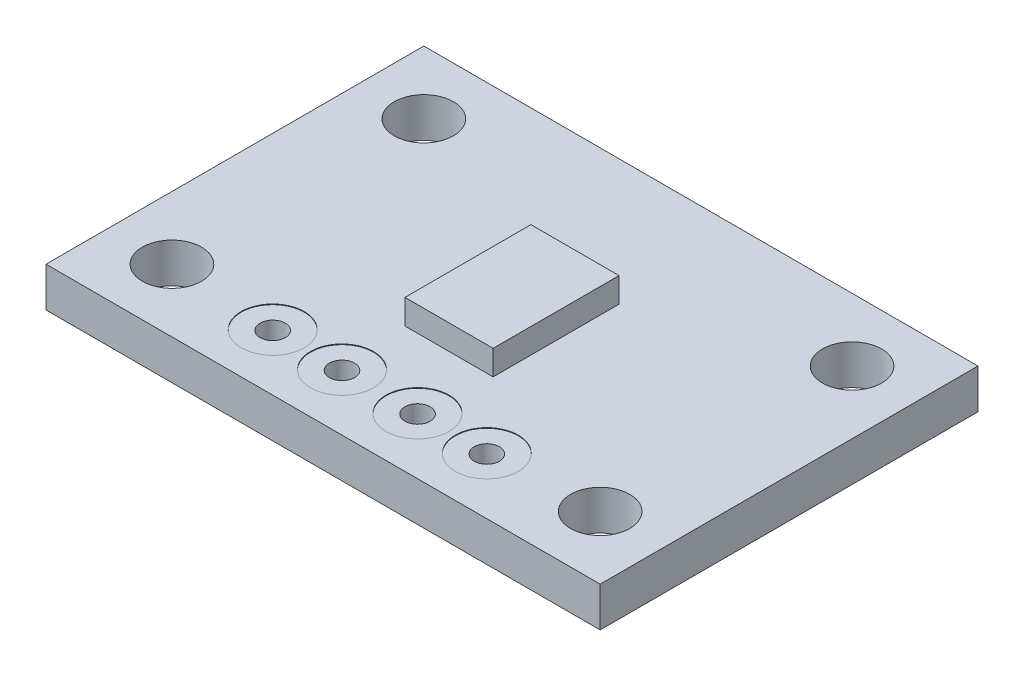
ISO-10303-21;
HEADER;
FILE_DESCRIPTION(('STEP AP214'),'2;1');
FILE_NAME('part.step','',(''),(''),'','','');
FILE_SCHEMA(('AUTOMOTIVE_DESIGN { 1 0 10303 214 1 1 1 1 }'));
ENDSEC;
DATA;
#1=APPLICATION_CONTEXT('core data for automotive mechanical design processes');
#2=APPLICATION_PROTOCOL_DEFINITION('international standard','automotive_design',2000,#1);
#3=PRODUCT_CONTEXT('',#1,'mechanical');
#4=PRODUCT('Part','Part','',(#3));
#5=PRODUCT_RELATED_PRODUCT_CATEGORY('part','',(#4));
#6=PRODUCT_DEFINITION_FORMATION('','',#4);
#7=PRODUCT_DEFINITION_CONTEXT('part definition',#1,'design');
#8=PRODUCT_DEFINITION('design','',#6,#7);
#9=PRODUCT_DEFINITION_SHAPE('','',#8);
#10=(LENGTH_UNIT() NAMED_UNIT(*) SI_UNIT(.MILLI.,.METRE.));
#11=(NAMED_UNIT(*) PLANE_ANGLE_UNIT() SI_UNIT($,.RADIAN.));
#12=(NAMED_UNIT(*) SI_UNIT($,.STERADIAN.) SOLID_ANGLE_UNIT());
#13=UNCERTAINTY_MEASURE_WITH_UNIT(LENGTH_MEASURE(1.E-05),#10,'distance_accuracy_value','');
#14=(GEOMETRIC_REPRESENTATION_CONTEXT(3) GLOBAL_UNCERTAINTY_ASSIGNED_CONTEXT((#13)) GLOBAL_UNIT_ASSIGNED_CONTEXT((#10,
#11,#12)) REPRESENTATION_CONTEXT('',''));
#15=CARTESIAN_POINT('',(0.,0.,0.));
#16=DIRECTION('',(0.,0.,1.));
#17=DIRECTION('',(1.,0.,0.));
#18=AXIS2_PLACEMENT_3D('',#15,#16,#17);
#19=CARTESIAN_POINT('',(-1.524,-0.8,5.334));
#20=DIRECTION('',(0.,1.,0.));
#21=DIRECTION('',(0.,0.,1.));
#22=AXIS2_PLACEMENT_3D('',#19,#20,#21);
#23=CYLINDRICAL_SURFACE('',#22,0.508);
#24=CARTESIAN_POINT('',(-1.524,0.7746,5.334));
#25=DIRECTION('',(0.,1.,0.));
#26=DIRECTION('',(0.,0.,1.));
#27=AXIS2_PLACEMENT_3D('',#24,#25,#26);
#28=CIRCLE('',#27,0.508);
#29=CARTESIAN_POINT('',(-1.524,0.7746,5.842));
#30=VERTEX_POINT('',#29);
#31=EDGE_CURVE('E188',#30,#30,#28,.F.);
#32=ORIENTED_EDGE('',*,*,#31,.F.);
#33=EDGE_LOOP('',(#32));
#34=FACE_BOUND('',#33,.T.);
#35=CARTESIAN_POINT('',(-1.524,-0.7746,5.334));
#36=DIRECTION('',(0.,-1.,0.));
#37=DIRECTION('',(0.,0.,-1.));
#38=AXIS2_PLACEMENT_3D('',#35,#36,#37);
#39=CIRCLE('',#38,0.508);
#40=CARTESIAN_POINT('',(-1.524,-0.7746,4.826));
#41=VERTEX_POINT('',#40);
#42=EDGE_CURVE('E40',#41,#41,#39,.F.);
#43=ORIENTED_EDGE('',*,*,#42,.F.);
#44=EDGE_LOOP('',(#43));
#45=FACE_BOUND('',#44,.T.);
#46=ADVANCED_FACE('F36',(#34,#45),#23,.F.);
#47=CARTESIAN_POINT('',(1.524,-0.8,5.334));
#48=DIRECTION('',(0.,1.,0.));
#49=DIRECTION('',(0.,0.,1.));
#50=AXIS2_PLACEMENT_3D('',#47,#48,#49);
#51=CYLINDRICAL_SURFACE('',#50,0.508);
#52=CARTESIAN_POINT('',(1.524,0.7746,5.334));
#53=DIRECTION('',(0.,1.,0.));
#54=DIRECTION('',(0.,0.,1.));
#55=AXIS2_PLACEMENT_3D('',#52,#53,#54);
#56=CIRCLE('',#55,0.508);
#57=CARTESIAN_POINT('',(1.524,0.7746,5.842));
#58=VERTEX_POINT('',#57);
#59=EDGE_CURVE('E185',#58,#58,#56,.F.);
#60=ORIENTED_EDGE('',*,*,#59,.F.);
#61=EDGE_LOOP('',(#60));
#62=FACE_BOUND('',#61,.T.);
#63=CARTESIAN_POINT('',(1.524,-0.7746,5.334));
#64=DIRECTION('',(0.,-1.,0.));
#65=DIRECTION('',(0.,0.,-1.));
#66=AXIS2_PLACEMENT_3D('',#63,#64,#65);
#67=CIRCLE('',#66,0.508);
#68=CARTESIAN_POINT('',(1.524,-0.7746,4.826));
#69=VERTEX_POINT('',#68);
#70=EDGE_CURVE('E197',#69,#69,#67,.F.);
#71=ORIENTED_EDGE('',*,*,#70,.F.);
#72=EDGE_LOOP('',(#71));
#73=FACE_BOUND('',#72,.T.);
#74=ADVANCED_FACE('F249',(#62,#73),#51,.F.);
#75=CARTESIAN_POINT('',(4.318,-0.8,5.334));
#76=DIRECTION('',(0.,1.,0.));
#77=DIRECTION('',(0.,0.,1.));
#78=AXIS2_PLACEMENT_3D('',#75,#76,#77);
#79=CYLINDRICAL_SURFACE('',#78,0.508);
#80=CARTESIAN_POINT('',(4.318,0.7746,5.334));
#81=DIRECTION('',(0.,1.,0.));
#82=DIRECTION('',(0.,0.,1.));
#83=AXIS2_PLACEMENT_3D('',#80,#81,#82);
#84=CIRCLE('',#83,0.508);
#85=CARTESIAN_POINT('',(4.318,0.7746,5.842));
#86=VERTEX_POINT('',#85);
#87=EDGE_CURVE('E181',#86,#86,#84,.F.);
#88=ORIENTED_EDGE('',*,*,#87,.F.);
#89=EDGE_LOOP('',(#88));
#90=FACE_BOUND('',#89,.T.);
#91=CARTESIAN_POINT('',(4.318,-0.7746,5.334));
#92=DIRECTION('',(0.,-1.,0.));
#93=DIRECTION('',(0.,0.,-1.));
#94=AXIS2_PLACEMENT_3D('',#91,#92,#93);
#95=CIRCLE('',#94,0.508);
#96=CARTESIAN_POINT('',(4.318,-0.7746,4.826));
#97=VERTEX_POINT('',#96);
#98=EDGE_CURVE('E194',#97,#97,#95,.F.);
#99=ORIENTED_EDGE('',*,*,#98,.F.);
#100=EDGE_LOOP('',(#99));
#101=FACE_BOUND('',#100,.T.);
#102=ADVANCED_FACE('F242',(#90,#101),#79,.F.);
#103=CARTESIAN_POINT('',(-4.318,-0.8,5.334));
#104=DIRECTION('',(0.,1.,0.));
#105=DIRECTION('',(0.,0.,1.));
#106=AXIS2_PLACEMENT_3D('',#103,#104,#105);
#107=CYLINDRICAL_SURFACE('',#106,0.508);
#108=CARTESIAN_POINT('',(-4.318,0.7746,5.334));
#109=DIRECTION('',(0.,1.,0.));
#110=DIRECTION('',(0.,0.,1.));
#111=AXIS2_PLACEMENT_3D('',#108,#109,#110);
#112=CIRCLE('',#111,0.508);
#113=CARTESIAN_POINT('',(-4.318,0.7746,5.842));
#114=VERTEX_POINT('',#113);
#115=EDGE_CURVE('E178',#114,#114,#112,.F.);
#116=ORIENTED_EDGE('',*,*,#115,.F.);
#117=EDGE_LOOP('',(#116));
#118=FACE_BOUND('',#117,.T.);
#119=CARTESIAN_POINT('',(-4.318,-0.7746,5.334));
#120=DIRECTION('',(0.,-1.,0.));
#121=DIRECTION('',(0.,0.,-1.));
#122=AXIS2_PLACEMENT_3D('',#119,#120,#121);
#123=CIRCLE('',#122,0.508);
#124=CARTESIAN_POINT('',(-4.318,-0.7746,4.826));
#125=VERTEX_POINT('',#124);
#126=EDGE_CURVE('E191',#125,#125,#123,.F.);
#127=ORIENTED_EDGE('',*,*,#126,.F.);
#128=EDGE_LOOP('',(#127));
#129=FACE_BOUND('',#128,.T.);
#130=ADVANCED_FACE('F233',(#118,#129),#107,.F.);
#131=CARTESIAN_POINT('',(0.,0.8,0.));
#132=DIRECTION('',(0.,-1.,0.));
#133=DIRECTION('',(0.,0.,-1.));
#134=AXIS2_PLACEMENT_3D('',#131,#132,#133);
#135=PLANE('',#134);
#136=CARTESIAN_POINT('',(-4.318,0.8,5.334));
#137=DIRECTION('',(0.,1.,0.));
#138=DIRECTION('',(0.,0.,1.));
#139=AXIS2_PLACEMENT_3D('',#136,#137,#138);
#140=CIRCLE('',#139,1.27);
#141=CARTESIAN_POINT('',(-4.318,0.8,6.604));
#142=VERTEX_POINT('',#141);
#143=EDGE_CURVE('E615',#142,#142,#140,.T.);
#144=ORIENTED_EDGE('',*,*,#143,.F.);
#145=EDGE_LOOP('',(#144));
#146=FACE_BOUND('',#145,.T.);
#147=CARTESIAN_POINT('',(-1.524,0.8,5.334));
#148=DIRECTION('',(0.,1.,0.));
#149=DIRECTION('',(0.,0.,1.));
#150=AXIS2_PLACEMENT_3D('',#147,#148,#149);
#151=CIRCLE('',#150,1.27);
#152=CARTESIAN_POINT('',(-1.524,0.8,6.604));
#153=VERTEX_POINT('',#152);
#154=EDGE_CURVE('E607',#153,#153,#151,.T.);
#155=ORIENTED_EDGE('',*,*,#154,.F.);
#156=EDGE_LOOP('',(#155));
#157=FACE_BOUND('',#156,.T.);
#158=CARTESIAN_POINT('',(1.524,0.8,5.334));
#159=DIRECTION('',(0.,1.,0.));
#160=DIRECTION('',(0.,0.,1.));
#161=AXIS2_PLACEMENT_3D('',#158,#159,#160);
#162=CIRCLE('',#161,1.27);
#163=CARTESIAN_POINT('',(1.524,0.8,6.604));
#164=VERTEX_POINT('',#163);
#165=EDGE_CURVE('E211',#164,#164,#162,.T.);
#166=ORIENTED_EDGE('',*,*,#165,.F.);
#167=EDGE_LOOP('',(#166));
#168=FACE_BOUND('',#167,.T.);
#169=CARTESIAN_POINT('',(4.318,0.8,5.334));
#170=DIRECTION('',(0.,1.,0.));
#171=DIRECTION('',(0.,0.,1.));
#172=AXIS2_PLACEMENT_3D('',#169,#170,#171);
#173=CIRCLE('',#172,1.27);
#174=CARTESIAN_POINT('',(4.318,0.8,6.604));
#175=VERTEX_POINT('',#174);
#176=EDGE_CURVE('E202',#175,#175,#173,.T.);
#177=ORIENTED_EDGE('',*,*,#176,.F.);
#178=EDGE_LOOP('',(#177));
#179=FACE_BOUND('',#178,.T.);
#180=CARTESIAN_POINT('',(-8.63599999999999,0.8,-5.08));
#181=DIRECTION('',(0.,1.,0.));
#182=DIRECTION('',(0.,0.,-1.));
#183=AXIS2_PLACEMENT_3D('',#180,#181,#182);
#184=CIRCLE('',#183,1.1938);
#185=CARTESIAN_POINT('',(-8.63599999999999,0.8,-6.2738));
#186=VERTEX_POINT('',#185);
#187=EDGE_CURVE('E126',#186,#186,#184,.T.);
#188=ORIENTED_EDGE('',*,*,#187,.F.);
#189=EDGE_LOOP('',(#188));
#190=FACE_BOUND('',#189,.T.);
#191=CARTESIAN_POINT('',(-8.63599999999999,0.8,5.07999999999999));
#192=DIRECTION('',(0.,1.,0.));
#193=DIRECTION('',(0.,0.,1.));
#194=AXIS2_PLACEMENT_3D('',#191,#192,#193);
#195=CIRCLE('',#194,1.1938);
#196=CARTESIAN_POINT('',(-8.63599999999999,0.8,6.27379999999999));
#197=VERTEX_POINT('',#196);
#198=EDGE_CURVE('E135',#197,#197,#195,.T.);
#199=ORIENTED_EDGE('',*,*,#198,.F.);
#200=EDGE_LOOP('',(#199));
#201=FACE_BOUND('',#200,.T.);
#202=CARTESIAN_POINT('',(8.636,0.8,5.07999999999999));
#203=DIRECTION('',(0.,1.,0.));
#204=DIRECTION('',(0.,0.,-1.));
#205=AXIS2_PLACEMENT_3D('',#202,#203,#204);
#206=CIRCLE('',#205,1.1938);
#207=CARTESIAN_POINT('',(8.636,0.8,3.8862));
#208=VERTEX_POINT('',#207);
#209=EDGE_CURVE('E141',#208,#208,#206,.T.);
#210=ORIENTED_EDGE('',*,*,#209,.F.);
#211=EDGE_LOOP('',(#210));
#212=FACE_BOUND('',#211,.T.);
#213=CARTESIAN_POINT('',(8.636,0.8,-5.08));
#214=DIRECTION('',(0.,1.,0.));
#215=DIRECTION('',(0.,0.,1.));
#216=AXIS2_PLACEMENT_3D('',#213,#214,#215);
#217=CIRCLE('',#216,1.1938);
#218=CARTESIAN_POINT('',(8.636,0.8,-3.8862));
#219=VERTEX_POINT('',#218);
#220=EDGE_CURVE('E147',#219,#219,#217,.T.);
#221=ORIENTED_EDGE('',*,*,#220,.F.);
#222=EDGE_LOOP('',(#221));
#223=FACE_BOUND('',#222,.T.);
#224=DIRECTION('',(0.,0.,-1.));
#225=VECTOR('',#224,1.);
#226=CARTESIAN_POINT('',(11.176,0.8,7.62));
#227=LINE('',#226,#225);
#228=CARTESIAN_POINT('',(11.176,0.8,7.62));
#229=VERTEX_POINT('',#228);
#230=CARTESIAN_POINT('',(11.176,0.8,-7.62));
#231=VERTEX_POINT('',#230);
#232=EDGE_CURVE('E153',#229,#231,#227,.T.);
#233=ORIENTED_EDGE('',*,*,#232,.T.);
#234=DIRECTION('',(-1.,0.,0.));
#235=VECTOR('',#234,1.);
#236=CARTESIAN_POINT('',(-11.176,0.8,-7.62));
#237=LINE('',#236,#235);
#238=CARTESIAN_POINT('',(-11.176,0.8,-7.62));
#239=VERTEX_POINT('',#238);
#240=EDGE_CURVE('E156',#231,#239,#237,.T.);
#241=ORIENTED_EDGE('',*,*,#240,.T.);
#242=DIRECTION('',(0.,0.,1.));
#243=VECTOR('',#242,1.);
#244=CARTESIAN_POINT('',(-11.176,0.8,7.62));
#245=LINE('',#244,#243);
#246=CARTESIAN_POINT('',(-11.176,0.8,7.62));
#247=VERTEX_POINT('',#246);
#248=EDGE_CURVE('E159',#239,#247,#245,.T.);
#249=ORIENTED_EDGE('',*,*,#248,.T.);
#250=DIRECTION('',(1.,0.,0.));
#251=VECTOR('',#250,1.);
#252=CARTESIAN_POINT('',(-11.176,0.8,7.62));
#253=LINE('',#252,#251);
#254=EDGE_CURVE('E161',#247,#229,#253,.T.);
#255=ORIENTED_EDGE('',*,*,#254,.T.);
#256=EDGE_LOOP('',(#233,#241,#249,#255));
#257=FACE_BOUND('',#256,.T.);
#258=DIRECTION('',(0.,0.,-1.));
#259=VECTOR('',#258,1.);
#260=CARTESIAN_POINT('',(1.778,0.8,2.54));
#261=LINE('',#260,#259);
#262=CARTESIAN_POINT('',(1.778,0.8,2.54));
#263=VERTEX_POINT('',#262);
#264=CARTESIAN_POINT('',(1.778,0.8,-2.54));
#265=VERTEX_POINT('',#264);
#266=EDGE_CURVE('E53',#263,#265,#261,.T.);
#267=ORIENTED_EDGE('',*,*,#266,.F.);
#268=DIRECTION('',(1.,0.,0.));
#269=VECTOR('',#268,1.);
#270=CARTESIAN_POINT('',(-1.778,0.8,2.54));
#271=LINE('',#270,#269);
#272=CARTESIAN_POINT('',(-1.778,0.8,2.54));
#273=VERTEX_POINT('',#272);
#274=EDGE_CURVE('E57',#273,#263,#271,.T.);
#275=ORIENTED_EDGE('',*,*,#274,.F.);
#276=DIRECTION('',(0.,0.,1.));
#277=VECTOR('',#276,1.);
#278=CARTESIAN_POINT('',(-1.778,0.8,2.54));
#279=LINE('',#278,#277);
#280=CARTESIAN_POINT('',(-1.778,0.8,-2.54));
#281=VERTEX_POINT('',#280);
#282=EDGE_CURVE('E221',#281,#273,#279,.T.);
#283=ORIENTED_EDGE('',*,*,#282,.F.);
#284=DIRECTION('',(-1.,0.,0.));
#285=VECTOR('',#284,1.);
#286=CARTESIAN_POINT('',(-1.778,0.8,-2.54));
#287=LINE('',#286,#285);
#288=EDGE_CURVE('E219',#265,#281,#287,.T.);
#289=ORIENTED_EDGE('',*,*,#288,.F.);
#290=EDGE_LOOP('',(#267,#275,#283,#289));
#291=FACE_BOUND('',#290,.T.);
#292=ADVANCED_FACE('F230',(#146,#157,#168,#179,#190,#201,#212,#223,#257,#291),#135,.F.);
#293=CARTESIAN_POINT('',(0.,-0.8,0.));
#294=DIRECTION('',(0.,-1.,0.));
#295=DIRECTION('',(0.,0.,-1.));
#296=AXIS2_PLACEMENT_3D('',#293,#294,#295);
#297=PLANE('',#296);
#298=CARTESIAN_POINT('',(-4.318,-0.8,5.334));
#299=DIRECTION('',(0.,1.,0.));
#300=DIRECTION('',(0.,0.,1.));
#301=AXIS2_PLACEMENT_3D('',#298,#299,#300);
#302=CIRCLE('',#301,1.27);
#303=CARTESIAN_POINT('',(-4.318,-0.8,6.604));
#304=VERTEX_POINT('',#303);
#305=EDGE_CURVE('E638',#304,#304,#302,.T.);
#306=ORIENTED_EDGE('',*,*,#305,.T.);
#307=EDGE_LOOP('',(#306));
#308=FACE_BOUND('',#307,.T.);
#309=CARTESIAN_POINT('',(-1.524,-0.8,5.334));
#310=DIRECTION('',(0.,1.,0.));
#311=DIRECTION('',(0.,0.,1.));
#312=AXIS2_PLACEMENT_3D('',#309,#310,#311);
#313=CIRCLE('',#312,1.27);
#314=CARTESIAN_POINT('',(-1.524,-0.8,6.604));
#315=VERTEX_POINT('',#314);
#316=EDGE_CURVE('E632',#315,#315,#313,.T.);
#317=ORIENTED_EDGE('',*,*,#316,.T.);
#318=EDGE_LOOP('',(#317));
#319=FACE_BOUND('',#318,.T.);
#320=CARTESIAN_POINT('',(1.524,-0.8,5.334));
#321=DIRECTION('',(0.,1.,0.));
#322=DIRECTION('',(0.,0.,1.));
#323=AXIS2_PLACEMENT_3D('',#320,#321,#322);
#324=CIRCLE('',#323,1.27);
#325=CARTESIAN_POINT('',(1.524,-0.8,6.604));
#326=VERTEX_POINT('',#325);
#327=EDGE_CURVE('E626',#326,#326,#324,.T.);
#328=ORIENTED_EDGE('',*,*,#327,.T.);
#329=EDGE_LOOP('',(#328));
#330=FACE_BOUND('',#329,.T.);
#331=CARTESIAN_POINT('',(4.318,-0.8,5.334));
#332=DIRECTION('',(0.,1.,0.));
#333=DIRECTION('',(0.,0.,1.));
#334=AXIS2_PLACEMENT_3D('',#331,#332,#333);
#335=CIRCLE('',#334,1.27);
#336=CARTESIAN_POINT('',(4.318,-0.8,6.604));
#337=VERTEX_POINT('',#336);
#338=EDGE_CURVE('E620',#337,#337,#335,.T.);
#339=ORIENTED_EDGE('',*,*,#338,.T.);
#340=EDGE_LOOP('',(#339));
#341=FACE_BOUND('',#340,.T.);
#342=CARTESIAN_POINT('',(-8.63599999999999,-0.8,5.07999999999999));
#343=DIRECTION('',(0.,1.,0.));
#344=DIRECTION('',(0.,0.,1.));
#345=AXIS2_PLACEMENT_3D('',#342,#343,#344);
#346=CIRCLE('',#345,1.1938);
#347=CARTESIAN_POINT('',(-8.63599999999999,-0.8,6.27379999999999));
#348=VERTEX_POINT('',#347);
#349=EDGE_CURVE('E133',#348,#348,#346,.T.);
#350=ORIENTED_EDGE('',*,*,#349,.T.);
#351=EDGE_LOOP('',(#350));
#352=FACE_BOUND('',#351,.T.);
#353=CARTESIAN_POINT('',(8.636,-0.8,-5.08));
#354=DIRECTION('',(0.,1.,0.));
#355=DIRECTION('',(0.,0.,1.));
#356=AXIS2_PLACEMENT_3D('',#353,#354,#355);
#357=CIRCLE('',#356,1.1938);
#358=CARTESIAN_POINT('',(8.636,-0.8,-3.8862));
#359=VERTEX_POINT('',#358);
#360=EDGE_CURVE('E144',#359,#359,#357,.T.);
#361=ORIENTED_EDGE('',*,*,#360,.T.);
#362=EDGE_LOOP('',(#361));
#363=FACE_BOUND('',#362,.T.);
#364=DIRECTION('',(0.,0.,-1.));
#365=VECTOR('',#364,1.);
#366=CARTESIAN_POINT('',(11.176,-0.8,7.62));
#367=LINE('',#366,#365);
#368=CARTESIAN_POINT('',(11.176,-0.8,7.62));
#369=VERTEX_POINT('',#368);
#370=CARTESIAN_POINT('',(11.176,-0.8,-7.62));
#371=VERTEX_POINT('',#370);
#372=EDGE_CURVE('E150',#369,#371,#367,.T.);
#373=ORIENTED_EDGE('',*,*,#372,.F.);
#374=DIRECTION('',(1.,0.,0.));
#375=VECTOR('',#374,1.);
#376=CARTESIAN_POINT('',(-11.176,-0.8,7.62));
#377=LINE('',#376,#375);
#378=CARTESIAN_POINT('',(-11.176,-0.8,7.62));
#379=VERTEX_POINT('',#378);
#380=EDGE_CURVE('E157',#379,#369,#377,.T.);
#381=ORIENTED_EDGE('',*,*,#380,.F.);
#382=DIRECTION('',(0.,0.,1.));
#383=VECTOR('',#382,1.);
#384=CARTESIAN_POINT('',(-11.176,-0.8,7.62));
#385=LINE('',#384,#383);
#386=CARTESIAN_POINT('',(-11.176,-0.8,-7.62));
#387=VERTEX_POINT('',#386);
#388=EDGE_CURVE('E168',#387,#379,#385,.T.);
#389=ORIENTED_EDGE('',*,*,#388,.F.);
#390=DIRECTION('',(-1.,0.,0.));
#391=VECTOR('',#390,1.);
#392=CARTESIAN_POINT('',(-11.176,-0.8,-7.62));
#393=LINE('',#392,#391);
#394=EDGE_CURVE('E166',#371,#387,#393,.T.);
#395=ORIENTED_EDGE('',*,*,#394,.F.);
#396=EDGE_LOOP('',(#373,#381,#389,#395));
#397=FACE_BOUND('',#396,.T.);
#398=CARTESIAN_POINT('',(8.636,-0.8,5.07999999999999));
#399=DIRECTION('',(0.,1.,0.));
#400=DIRECTION('',(0.,0.,-1.));
#401=AXIS2_PLACEMENT_3D('',#398,#399,#400);
#402=CIRCLE('',#401,1.1938);
#403=CARTESIAN_POINT('',(8.636,-0.8,3.8862));
#404=VERTEX_POINT('',#403);
#405=EDGE_CURVE('E138',#404,#404,#402,.T.);
#406=ORIENTED_EDGE('',*,*,#405,.T.);
#407=EDGE_LOOP('',(#406));
#408=FACE_BOUND('',#407,.T.);
#409=CARTESIAN_POINT('',(-8.63599999999999,-0.8,-5.08));
#410=DIRECTION('',(0.,1.,0.));
#411=DIRECTION('',(0.,0.,-1.));
#412=AXIS2_PLACEMENT_3D('',#409,#410,#411);
#413=CIRCLE('',#412,1.1938);
#414=CARTESIAN_POINT('',(-8.63599999999999,-0.8,-6.2738));
#415=VERTEX_POINT('',#414);
#416=EDGE_CURVE('E123',#415,#415,#413,.T.);
#417=ORIENTED_EDGE('',*,*,#416,.T.);
#418=EDGE_LOOP('',(#417));
#419=FACE_BOUND('',#418,.T.);
#420=ADVANCED_FACE('F232',(#308,#319,#330,#341,#352,#363,#397,#408,#419),#297,.T.);
#421=CARTESIAN_POINT('',(11.176,0.8,7.62));
#422=DIRECTION('',(-1.,0.,0.));
#423=DIRECTION('',(0.,0.,1.));
#424=AXIS2_PLACEMENT_3D('',#421,#422,#423);
#425=PLANE('',#424);
#426=ORIENTED_EDGE('',*,*,#372,.T.);
#427=DIRECTION('',(0.,-1.,0.));
#428=VECTOR('',#427,1.);
#429=CARTESIAN_POINT('',(11.176,0.8,-7.62));
#430=LINE('',#429,#428);
#431=EDGE_CURVE('E11',#231,#371,#430,.T.);
#432=ORIENTED_EDGE('',*,*,#431,.F.);
#433=ORIENTED_EDGE('',*,*,#232,.F.);
#434=DIRECTION('',(0.,-1.,0.));
#435=VECTOR('',#434,1.);
#436=CARTESIAN_POINT('',(11.176,0.8,7.62));
#437=LINE('',#436,#435);
#438=EDGE_CURVE('E163',#229,#369,#437,.T.);
#439=ORIENTED_EDGE('',*,*,#438,.T.);
#440=EDGE_LOOP('',(#426,#432,#433,#439));
#441=FACE_BOUND('',#440,.T.);
#442=ADVANCED_FACE('F38',(#441),#425,.F.);
#443=CARTESIAN_POINT('',(-11.176,0.8,-7.62));
#444=DIRECTION('',(0.,0.,1.));
#445=DIRECTION('',(1.,0.,0.));
#446=AXIS2_PLACEMENT_3D('',#443,#444,#445);
#447=PLANE('',#446);
#448=ORIENTED_EDGE('',*,*,#394,.T.);
#449=DIRECTION('',(0.,-1.,0.));
#450=VECTOR('',#449,1.);
#451=CARTESIAN_POINT('',(-11.176,0.8,-7.62));
#452=LINE('',#451,#450);
#453=EDGE_CURVE('E45',#239,#387,#452,.T.);
#454=ORIENTED_EDGE('',*,*,#453,.F.);
#455=ORIENTED_EDGE('',*,*,#240,.F.);
#456=ORIENTED_EDGE('',*,*,#431,.T.);
#457=EDGE_LOOP('',(#448,#454,#455,#456));
#458=FACE_BOUND('',#457,.T.);
#459=ADVANCED_FACE('F317',(#458),#447,.F.);
#460=CARTESIAN_POINT('',(-11.176,0.8,7.62));
#461=DIRECTION('',(1.,0.,0.));
#462=DIRECTION('',(0.,0.,-1.));
#463=AXIS2_PLACEMENT_3D('',#460,#461,#462);
#464=PLANE('',#463);
#465=ORIENTED_EDGE('',*,*,#388,.T.);
#466=DIRECTION('',(0.,-1.,0.));
#467=VECTOR('',#466,1.);
#468=CARTESIAN_POINT('',(-11.176,0.8,7.62));
#469=LINE('',#468,#467);
#470=EDGE_CURVE('E173',#247,#379,#469,.T.);
#471=ORIENTED_EDGE('',*,*,#470,.F.);
#472=ORIENTED_EDGE('',*,*,#248,.F.);
#473=ORIENTED_EDGE('',*,*,#453,.T.);
#474=EDGE_LOOP('',(#465,#471,#472,#473));
#475=FACE_BOUND('',#474,.T.);
#476=ADVANCED_FACE('F290',(#475),#464,.F.);
#477=CARTESIAN_POINT('',(-11.176,0.8,7.62));
#478=DIRECTION('',(0.,0.,-1.));
#479=DIRECTION('',(-1.,0.,0.));
#480=AXIS2_PLACEMENT_3D('',#477,#478,#479);
#481=PLANE('',#480);
#482=ORIENTED_EDGE('',*,*,#380,.T.);
#483=ORIENTED_EDGE('',*,*,#438,.F.);
#484=ORIENTED_EDGE('',*,*,#254,.F.);
#485=ORIENTED_EDGE('',*,*,#470,.T.);
#486=EDGE_LOOP('',(#482,#483,#484,#485));
#487=FACE_BOUND('',#486,.T.);
#488=ADVANCED_FACE('F285',(#487),#481,.F.);
#489=CARTESIAN_POINT('',(8.636,0.8,-5.08));
#490=DIRECTION('',(0.,-1.,0.));
#491=DIRECTION('',(0.,0.,-1.));
#492=AXIS2_PLACEMENT_3D('',#489,#490,#491);
#493=CYLINDRICAL_SURFACE('',#492,1.1938);
#494=ORIENTED_EDGE('',*,*,#220,.T.);
#495=EDGE_LOOP('',(#494));
#496=FACE_BOUND('',#495,.T.);
#497=ORIENTED_EDGE('',*,*,#360,.F.);
#498=EDGE_LOOP('',(#497));
#499=FACE_BOUND('',#498,.T.);
#500=ADVANCED_FACE('F282',(#496,#499),#493,.F.);
#501=CARTESIAN_POINT('',(8.636,0.8,5.07999999999999));
#502=DIRECTION('',(0.,-1.,0.));
#503=DIRECTION('',(0.,0.,-1.));
#504=AXIS2_PLACEMENT_3D('',#501,#502,#503);
#505=CYLINDRICAL_SURFACE('',#504,1.1938);
#506=ORIENTED_EDGE('',*,*,#209,.T.);
#507=EDGE_LOOP('',(#506));
#508=FACE_BOUND('',#507,.T.);
#509=ORIENTED_EDGE('',*,*,#405,.F.);
#510=EDGE_LOOP('',(#509));
#511=FACE_BOUND('',#510,.T.);
#512=ADVANCED_FACE('F279',(#508,#511),#505,.F.);
#513=CARTESIAN_POINT('',(-8.63599999999999,0.8,5.07999999999999));
#514=DIRECTION('',(0.,-1.,0.));
#515=DIRECTION('',(0.,0.,-1.));
#516=AXIS2_PLACEMENT_3D('',#513,#514,#515);
#517=CYLINDRICAL_SURFACE('',#516,1.1938);
#518=ORIENTED_EDGE('',*,*,#198,.T.);
#519=EDGE_LOOP('',(#518));
#520=FACE_BOUND('',#519,.T.);
#521=ORIENTED_EDGE('',*,*,#349,.F.);
#522=EDGE_LOOP('',(#521));
#523=FACE_BOUND('',#522,.T.);
#524=ADVANCED_FACE('F275',(#520,#523),#517,.F.);
#525=CARTESIAN_POINT('',(-8.63599999999999,0.8,-5.08));
#526=DIRECTION('',(0.,-1.,0.));
#527=DIRECTION('',(0.,0.,-1.));
#528=AXIS2_PLACEMENT_3D('',#525,#526,#527);
#529=CYLINDRICAL_SURFACE('',#528,1.1938);
#530=ORIENTED_EDGE('',*,*,#187,.T.);
#531=EDGE_LOOP('',(#530));
#532=FACE_BOUND('',#531,.T.);
#533=ORIENTED_EDGE('',*,*,#416,.F.);
#534=EDGE_LOOP('',(#533));
#535=FACE_BOUND('',#534,.T.);
#536=ADVANCED_FACE('F272',(#532,#535),#529,.F.);
#537=CARTESIAN_POINT('',(1.778,1.8,2.54));
#538=DIRECTION('',(-1.,0.,0.));
#539=DIRECTION('',(0.,0.,1.));
#540=AXIS2_PLACEMENT_3D('',#537,#538,#539);
#541=PLANE('',#540);
#542=ORIENTED_EDGE('',*,*,#266,.T.);
#543=DIRECTION('',(0.,-1.,0.));
#544=VECTOR('',#543,1.);
#545=CARTESIAN_POINT('',(1.778,1.8,-2.54));
#546=LINE('',#545,#544);
#547=CARTESIAN_POINT('',(1.778,1.8,-2.54));
#548=VERTEX_POINT('',#547);
#549=EDGE_CURVE('E106',#548,#265,#546,.T.);
#550=ORIENTED_EDGE('',*,*,#549,.F.);
#551=DIRECTION('',(0.,0.,-1.));
#552=VECTOR('',#551,1.);
#553=CARTESIAN_POINT('',(1.778,1.8,2.54));
#554=LINE('',#553,#552);
#555=CARTESIAN_POINT('',(1.778,1.8,2.54));
#556=VERTEX_POINT('',#555);
#557=EDGE_CURVE('E112',#556,#548,#554,.T.);
#558=ORIENTED_EDGE('',*,*,#557,.F.);
#559=DIRECTION('',(0.,-1.,0.));
#560=VECTOR('',#559,1.);
#561=CARTESIAN_POINT('',(1.778,1.8,2.54));
#562=LINE('',#561,#560);
#563=EDGE_CURVE('E217',#556,#263,#562,.T.);
#564=ORIENTED_EDGE('',*,*,#563,.T.);
#565=EDGE_LOOP('',(#542,#550,#558,#564));
#566=FACE_BOUND('',#565,.T.);
#567=ADVANCED_FACE('F122',(#566),#541,.F.);
#568=CARTESIAN_POINT('',(-1.778,1.8,-2.54));
#569=DIRECTION('',(0.,0.,1.));
#570=DIRECTION('',(1.,0.,0.));
#571=AXIS2_PLACEMENT_3D('',#568,#569,#570);
#572=PLANE('',#571);
#573=ORIENTED_EDGE('',*,*,#288,.T.);
#574=DIRECTION('',(0.,-1.,0.));
#575=VECTOR('',#574,1.);
#576=CARTESIAN_POINT('',(-1.778,1.8,-2.54));
#577=LINE('',#576,#575);
#578=CARTESIAN_POINT('',(-1.778,1.8,-2.54));
#579=VERTEX_POINT('',#578);
#580=EDGE_CURVE('E108',#579,#281,#577,.T.);
#581=ORIENTED_EDGE('',*,*,#580,.F.);
#582=DIRECTION('',(-1.,0.,0.));
#583=VECTOR('',#582,1.);
#584=CARTESIAN_POINT('',(-1.778,1.8,-2.54));
#585=LINE('',#584,#583);
#586=EDGE_CURVE('E101',#548,#579,#585,.T.);
#587=ORIENTED_EDGE('',*,*,#586,.F.);
#588=ORIENTED_EDGE('',*,*,#549,.T.);
#589=EDGE_LOOP('',(#573,#581,#587,#588));
#590=FACE_BOUND('',#589,.T.);
#591=ADVANCED_FACE('F104',(#590),#572,.F.);
#592=CARTESIAN_POINT('',(-1.778,1.8,2.54));
#593=DIRECTION('',(1.,0.,0.));
#594=DIRECTION('',(0.,0.,-1.));
#595=AXIS2_PLACEMENT_3D('',#592,#593,#594);
#596=PLANE('',#595);
#597=ORIENTED_EDGE('',*,*,#282,.T.);
#598=DIRECTION('',(0.,-1.,0.));
#599=VECTOR('',#598,1.);
#600=CARTESIAN_POINT('',(-1.778,1.8,2.54));
#601=LINE('',#600,#599);
#602=CARTESIAN_POINT('',(-1.778,1.8,2.54));
#603=VERTEX_POINT('',#602);
#604=EDGE_CURVE('E128',#603,#273,#601,.T.);
#605=ORIENTED_EDGE('',*,*,#604,.F.);
#606=DIRECTION('',(0.,0.,1.));
#607=VECTOR('',#606,1.);
#608=CARTESIAN_POINT('',(-1.778,1.8,2.54));
#609=LINE('',#608,#607);
#610=EDGE_CURVE('E111',#579,#603,#609,.T.);
#611=ORIENTED_EDGE('',*,*,#610,.F.);
#612=ORIENTED_EDGE('',*,*,#580,.T.);
#613=EDGE_LOOP('',(#597,#605,#611,#612));
#614=FACE_BOUND('',#613,.T.);
#615=ADVANCED_FACE('F229',(#614),#596,.F.);
#616=CARTESIAN_POINT('',(-1.778,1.8,2.54));
#617=DIRECTION('',(0.,0.,-1.));
#618=DIRECTION('',(-1.,0.,0.));
#619=AXIS2_PLACEMENT_3D('',#616,#617,#618);
#620=PLANE('',#619);
#621=ORIENTED_EDGE('',*,*,#274,.T.);
#622=ORIENTED_EDGE('',*,*,#563,.F.);
#623=DIRECTION('',(1.,0.,0.));
#624=VECTOR('',#623,1.);
#625=CARTESIAN_POINT('',(-1.778,1.8,2.54));
#626=LINE('',#625,#624);
#627=EDGE_CURVE('E117',#603,#556,#626,.T.);
#628=ORIENTED_EDGE('',*,*,#627,.F.);
#629=ORIENTED_EDGE('',*,*,#604,.T.);
#630=EDGE_LOOP('',(#621,#622,#628,#629));
#631=FACE_BOUND('',#630,.T.);
#632=ADVANCED_FACE('F227',(#631),#620,.F.);
#633=CARTESIAN_POINT('',(0.,1.8,0.));
#634=DIRECTION('',(0.,-1.,0.));
#635=DIRECTION('',(0.,0.,-1.));
#636=AXIS2_PLACEMENT_3D('',#633,#634,#635);
#637=PLANE('',#636);
#638=ORIENTED_EDGE('',*,*,#557,.T.);
#639=ORIENTED_EDGE('',*,*,#586,.T.);
#640=ORIENTED_EDGE('',*,*,#610,.T.);
#641=ORIENTED_EDGE('',*,*,#627,.T.);
#642=EDGE_LOOP('',(#638,#639,#640,#641));
#643=FACE_BOUND('',#642,.T.);
#644=ADVANCED_FACE('F115',(#643),#637,.F.);
#645=CARTESIAN_POINT('',(-4.318,0.7746,5.334));
#646=DIRECTION('',(0.,1.,0.));
#647=DIRECTION('',(0.,0.,1.));
#648=AXIS2_PLACEMENT_3D('',#645,#646,#647);
#649=PLANE('',#648);
#650=CARTESIAN_POINT('',(-4.318,0.7746,5.334));
#651=DIRECTION('',(0.,1.,0.));
#652=DIRECTION('',(0.,0.,1.));
#653=AXIS2_PLACEMENT_3D('',#650,#651,#652);
#654=CIRCLE('',#653,1.27);
#655=CARTESIAN_POINT('',(-4.318,0.7746,6.604));
#656=VERTEX_POINT('',#655);
#657=EDGE_CURVE('E182',#656,#656,#654,.T.);
#658=ORIENTED_EDGE('',*,*,#657,.T.);
#659=EDGE_LOOP('',(#658));
#660=FACE_BOUND('',#659,.T.);
#661=ORIENTED_EDGE('',*,*,#115,.T.);
#662=EDGE_LOOP('',(#661));
#663=FACE_BOUND('',#662,.T.);
#664=ADVANCED_FACE('F263',(#660,#663),#649,.T.);
#665=CARTESIAN_POINT('',(-4.318,0.7746,5.334));
#666=DIRECTION('',(0.,1.,0.));
#667=DIRECTION('',(0.,0.,1.));
#668=AXIS2_PLACEMENT_3D('',#665,#666,#667);
#669=CYLINDRICAL_SURFACE('',#668,1.27);
#670=ORIENTED_EDGE('',*,*,#657,.F.);
#671=EDGE_LOOP('',(#670));
#672=FACE_BOUND('',#671,.T.);
#673=ORIENTED_EDGE('',*,*,#143,.T.);
#674=EDGE_LOOP('',(#673));
#675=FACE_BOUND('',#674,.T.);
#676=ADVANCED_FACE('F427',(#672,#675),#669,.F.);
#677=CARTESIAN_POINT('',(4.318,0.7746,5.334));
#678=DIRECTION('',(0.,1.,0.));
#679=DIRECTION('',(0.,0.,1.));
#680=AXIS2_PLACEMENT_3D('',#677,#678,#679);
#681=PLANE('',#680);
#682=CARTESIAN_POINT('',(4.318,0.7746,5.334));
#683=DIRECTION('',(0.,1.,0.));
#684=DIRECTION('',(0.,0.,1.));
#685=AXIS2_PLACEMENT_3D('',#682,#683,#684);
#686=CIRCLE('',#685,1.27);
#687=CARTESIAN_POINT('',(4.318,0.7746,6.604));
#688=VERTEX_POINT('',#687);
#689=EDGE_CURVE('E206',#688,#688,#686,.T.);
#690=ORIENTED_EDGE('',*,*,#689,.T.);
#691=EDGE_LOOP('',(#690));
#692=FACE_BOUND('',#691,.T.);
#693=ORIENTED_EDGE('',*,*,#87,.T.);
#694=EDGE_LOOP('',(#693));
#695=FACE_BOUND('',#694,.T.);
#696=ADVANCED_FACE('F431',(#692,#695),#681,.T.);
#697=CARTESIAN_POINT('',(4.318,0.7746,5.334));
#698=DIRECTION('',(0.,1.,0.));
#699=DIRECTION('',(0.,0.,1.));
#700=AXIS2_PLACEMENT_3D('',#697,#698,#699);
#701=CYLINDRICAL_SURFACE('',#700,1.27);
#702=ORIENTED_EDGE('',*,*,#689,.F.);
#703=EDGE_LOOP('',(#702));
#704=FACE_BOUND('',#703,.T.);
#705=ORIENTED_EDGE('',*,*,#176,.T.);
#706=EDGE_LOOP('',(#705));
#707=FACE_BOUND('',#706,.T.);
#708=ADVANCED_FACE('F443',(#704,#707),#701,.F.);
#709=CARTESIAN_POINT('',(1.524,0.7746,5.334));
#710=DIRECTION('',(0.,1.,0.));
#711=DIRECTION('',(0.,0.,1.));
#712=AXIS2_PLACEMENT_3D('',#709,#710,#711);
#713=PLANE('',#712);
#714=CARTESIAN_POINT('',(1.524,0.7746,5.334));
#715=DIRECTION('',(0.,1.,0.));
#716=DIRECTION('',(0.,0.,1.));
#717=AXIS2_PLACEMENT_3D('',#714,#715,#716);
#718=CIRCLE('',#717,1.27);
#719=CARTESIAN_POINT('',(1.524,0.7746,6.604));
#720=VERTEX_POINT('',#719);
#721=EDGE_CURVE('E603',#720,#720,#718,.T.);
#722=ORIENTED_EDGE('',*,*,#721,.T.);
#723=EDGE_LOOP('',(#722));
#724=FACE_BOUND('',#723,.T.);
#725=ORIENTED_EDGE('',*,*,#59,.T.);
#726=EDGE_LOOP('',(#725));
#727=FACE_BOUND('',#726,.T.);
#728=ADVANCED_FACE('F440',(#724,#727),#713,.T.);
#729=CARTESIAN_POINT('',(1.524,0.7746,5.334));
#730=DIRECTION('',(0.,1.,0.));
#731=DIRECTION('',(0.,0.,1.));
#732=AXIS2_PLACEMENT_3D('',#729,#730,#731);
#733=CYLINDRICAL_SURFACE('',#732,1.27);
#734=ORIENTED_EDGE('',*,*,#721,.F.);
#735=EDGE_LOOP('',(#734));
#736=FACE_BOUND('',#735,.T.);
#737=ORIENTED_EDGE('',*,*,#165,.T.);
#738=EDGE_LOOP('',(#737));
#739=FACE_BOUND('',#738,.T.);
#740=ADVANCED_FACE('F436',(#736,#739),#733,.F.);
#741=CARTESIAN_POINT('',(-1.524,0.7746,5.334));
#742=DIRECTION('',(0.,1.,0.));
#743=DIRECTION('',(0.,0.,1.));
#744=AXIS2_PLACEMENT_3D('',#741,#742,#743);
#745=PLANE('',#744);
#746=CARTESIAN_POINT('',(-1.524,0.7746,5.334));
#747=DIRECTION('',(0.,1.,0.));
#748=DIRECTION('',(0.,0.,1.));
#749=AXIS2_PLACEMENT_3D('',#746,#747,#748);
#750=CIRCLE('',#749,1.27);
#751=CARTESIAN_POINT('',(-1.524,0.7746,6.604));
#752=VERTEX_POINT('',#751);
#753=EDGE_CURVE('E612',#752,#752,#750,.T.);
#754=ORIENTED_EDGE('',*,*,#753,.T.);
#755=EDGE_LOOP('',(#754));
#756=FACE_BOUND('',#755,.T.);
#757=ORIENTED_EDGE('',*,*,#31,.T.);
#758=EDGE_LOOP('',(#757));
#759=FACE_BOUND('',#758,.T.);
#760=ADVANCED_FACE('F433',(#756,#759),#745,.T.);
#761=CARTESIAN_POINT('',(-1.524,0.7746,5.334));
#762=DIRECTION('',(0.,1.,0.));
#763=DIRECTION('',(0.,0.,1.));
#764=AXIS2_PLACEMENT_3D('',#761,#762,#763);
#765=CYLINDRICAL_SURFACE('',#764,1.27);
#766=ORIENTED_EDGE('',*,*,#753,.F.);
#767=EDGE_LOOP('',(#766));
#768=FACE_BOUND('',#767,.T.);
#769=ORIENTED_EDGE('',*,*,#154,.T.);
#770=EDGE_LOOP('',(#769));
#771=FACE_BOUND('',#770,.T.);
#772=ADVANCED_FACE('F346',(#768,#771),#765,.F.);
#773=CARTESIAN_POINT('',(4.318,-0.7746,5.334));
#774=DIRECTION('',(0.,-1.,0.));
#775=DIRECTION('',(0.,0.,1.));
#776=AXIS2_PLACEMENT_3D('',#773,#774,#775);
#777=PLANE('',#776);
#778=CARTESIAN_POINT('',(4.318,-0.7746,5.334));
#779=DIRECTION('',(0.,1.,0.));
#780=DIRECTION('',(0.,0.,1.));
#781=AXIS2_PLACEMENT_3D('',#778,#779,#780);
#782=CIRCLE('',#781,1.27);
#783=CARTESIAN_POINT('',(4.318,-0.7746,6.604));
#784=VERTEX_POINT('',#783);
#785=EDGE_CURVE('E623',#784,#784,#782,.T.);
#786=ORIENTED_EDGE('',*,*,#785,.F.);
#787=EDGE_LOOP('',(#786));
#788=FACE_BOUND('',#787,.T.);
#789=ORIENTED_EDGE('',*,*,#98,.T.);
#790=EDGE_LOOP('',(#789));
#791=FACE_BOUND('',#790,.T.);
#792=ADVANCED_FACE('F340',(#788,#791),#777,.T.);
#793=CARTESIAN_POINT('',(4.318,-0.7746,5.334));
#794=DIRECTION('',(0.,-1.,0.));
#795=DIRECTION('',(0.,0.,-1.));
#796=AXIS2_PLACEMENT_3D('',#793,#794,#795);
#797=CYLINDRICAL_SURFACE('',#796,1.27);
#798=ORIENTED_EDGE('',*,*,#785,.T.);
#799=EDGE_LOOP('',(#798));
#800=FACE_BOUND('',#799,.T.);
#801=ORIENTED_EDGE('',*,*,#338,.F.);
#802=EDGE_LOOP('',(#801));
#803=FACE_BOUND('',#802,.T.);
#804=ADVANCED_FACE('F345',(#800,#803),#797,.F.);
#805=CARTESIAN_POINT('',(1.524,-0.7746,5.334));
#806=DIRECTION('',(0.,-1.,0.));
#807=DIRECTION('',(0.,0.,1.));
#808=AXIS2_PLACEMENT_3D('',#805,#806,#807);
#809=PLANE('',#808);
#810=CARTESIAN_POINT('',(1.524,-0.7746,5.334));
#811=DIRECTION('',(0.,1.,0.));
#812=DIRECTION('',(0.,0.,1.));
#813=AXIS2_PLACEMENT_3D('',#810,#811,#812);
#814=CIRCLE('',#813,1.27);
#815=CARTESIAN_POINT('',(1.524,-0.7746,6.604));
#816=VERTEX_POINT('',#815);
#817=EDGE_CURVE('E629',#816,#816,#814,.T.);
#818=ORIENTED_EDGE('',*,*,#817,.F.);
#819=EDGE_LOOP('',(#818));
#820=FACE_BOUND('',#819,.T.);
#821=ORIENTED_EDGE('',*,*,#70,.T.);
#822=EDGE_LOOP('',(#821));
#823=FACE_BOUND('',#822,.T.);
#824=ADVANCED_FACE('F358',(#820,#823),#809,.T.);
#825=CARTESIAN_POINT('',(1.524,-0.7746,5.334));
#826=DIRECTION('',(0.,-1.,0.));
#827=DIRECTION('',(0.,0.,-1.));
#828=AXIS2_PLACEMENT_3D('',#825,#826,#827);
#829=CYLINDRICAL_SURFACE('',#828,1.27);
#830=ORIENTED_EDGE('',*,*,#817,.T.);
#831=EDGE_LOOP('',(#830));
#832=FACE_BOUND('',#831,.T.);
#833=ORIENTED_EDGE('',*,*,#327,.F.);
#834=EDGE_LOOP('',(#833));
#835=FACE_BOUND('',#834,.T.);
#836=ADVANCED_FACE('F368',(#832,#835),#829,.F.);
#837=CARTESIAN_POINT('',(-1.524,-0.7746,5.334));
#838=DIRECTION('',(0.,-1.,0.));
#839=DIRECTION('',(0.,0.,1.));
#840=AXIS2_PLACEMENT_3D('',#837,#838,#839);
#841=PLANE('',#840);
#842=CARTESIAN_POINT('',(-1.524,-0.7746,5.334));
#843=DIRECTION('',(0.,1.,0.));
#844=DIRECTION('',(0.,0.,1.));
#845=AXIS2_PLACEMENT_3D('',#842,#843,#844);
#846=CIRCLE('',#845,1.27);
#847=CARTESIAN_POINT('',(-1.524,-0.7746,6.604));
#848=VERTEX_POINT('',#847);
#849=EDGE_CURVE('E635',#848,#848,#846,.T.);
#850=ORIENTED_EDGE('',*,*,#849,.F.);
#851=EDGE_LOOP('',(#850));
#852=FACE_BOUND('',#851,.T.);
#853=ORIENTED_EDGE('',*,*,#42,.T.);
#854=EDGE_LOOP('',(#853));
#855=FACE_BOUND('',#854,.T.);
#856=ADVANCED_FACE('F378',(#852,#855),#841,.T.);
#857=CARTESIAN_POINT('',(-1.524,-0.7746,5.334));
#858=DIRECTION('',(0.,-1.,0.));
#859=DIRECTION('',(0.,0.,-1.));
#860=AXIS2_PLACEMENT_3D('',#857,#858,#859);
#861=CYLINDRICAL_SURFACE('',#860,1.27);
#862=ORIENTED_EDGE('',*,*,#849,.T.);
#863=EDGE_LOOP('',(#862));
#864=FACE_BOUND('',#863,.T.);
#865=ORIENTED_EDGE('',*,*,#316,.F.);
#866=EDGE_LOOP('',(#865));
#867=FACE_BOUND('',#866,.T.);
#868=ADVANCED_FACE('F388',(#864,#867),#861,.F.);
#869=CARTESIAN_POINT('',(-4.318,-0.7746,5.334));
#870=DIRECTION('',(0.,-1.,0.));
#871=DIRECTION('',(0.,0.,1.));
#872=AXIS2_PLACEMENT_3D('',#869,#870,#871);
#873=PLANE('',#872);
#874=CARTESIAN_POINT('',(-4.318,-0.7746,5.334));
#875=DIRECTION('',(0.,1.,0.));
#876=DIRECTION('',(0.,0.,1.));
#877=AXIS2_PLACEMENT_3D('',#874,#875,#876);
#878=CIRCLE('',#877,1.27);
#879=CARTESIAN_POINT('',(-4.318,-0.7746,6.604));
#880=VERTEX_POINT('',#879);
#881=EDGE_CURVE('E195',#880,#880,#878,.T.);
#882=ORIENTED_EDGE('',*,*,#881,.F.);
#883=EDGE_LOOP('',(#882));
#884=FACE_BOUND('',#883,.T.);
#885=ORIENTED_EDGE('',*,*,#126,.T.);
#886=EDGE_LOOP('',(#885));
#887=FACE_BOUND('',#886,.T.);
#888=ADVANCED_FACE('F398',(#884,#887),#873,.T.);
#889=CARTESIAN_POINT('',(-4.318,-0.7746,5.334));
#890=DIRECTION('',(0.,-1.,0.));
#891=DIRECTION('',(0.,0.,-1.));
#892=AXIS2_PLACEMENT_3D('',#889,#890,#891);
#893=CYLINDRICAL_SURFACE('',#892,1.27);
#894=ORIENTED_EDGE('',*,*,#881,.T.);
#895=EDGE_LOOP('',(#894));
#896=FACE_BOUND('',#895,.T.);
#897=ORIENTED_EDGE('',*,*,#305,.F.);
#898=EDGE_LOOP('',(#897));
#899=FACE_BOUND('',#898,.T.);
#900=ADVANCED_FACE('F408',(#896,#899),#893,.F.);
#901=CLOSED_SHELL('',(#46,#74,#102,#130,#292,#420,#442,#459,#476,#488,#500,#512,#524,#536,#567,
#591,#615,#632,#644,#664,#676,#696,#708,#728,#740,#760,#772,#792,#804,#824,#836,#856,#868,#888,#900));
#902=MANIFOLD_SOLID_BREP('B2',#901);
#903=ADVANCED_BREP_SHAPE_REPRESENTATION('',(#18,#902),#14);
#904=SHAPE_DEFINITION_REPRESENTATION(#9,#903);
ENDSEC;
END-ISO-10303-21;
